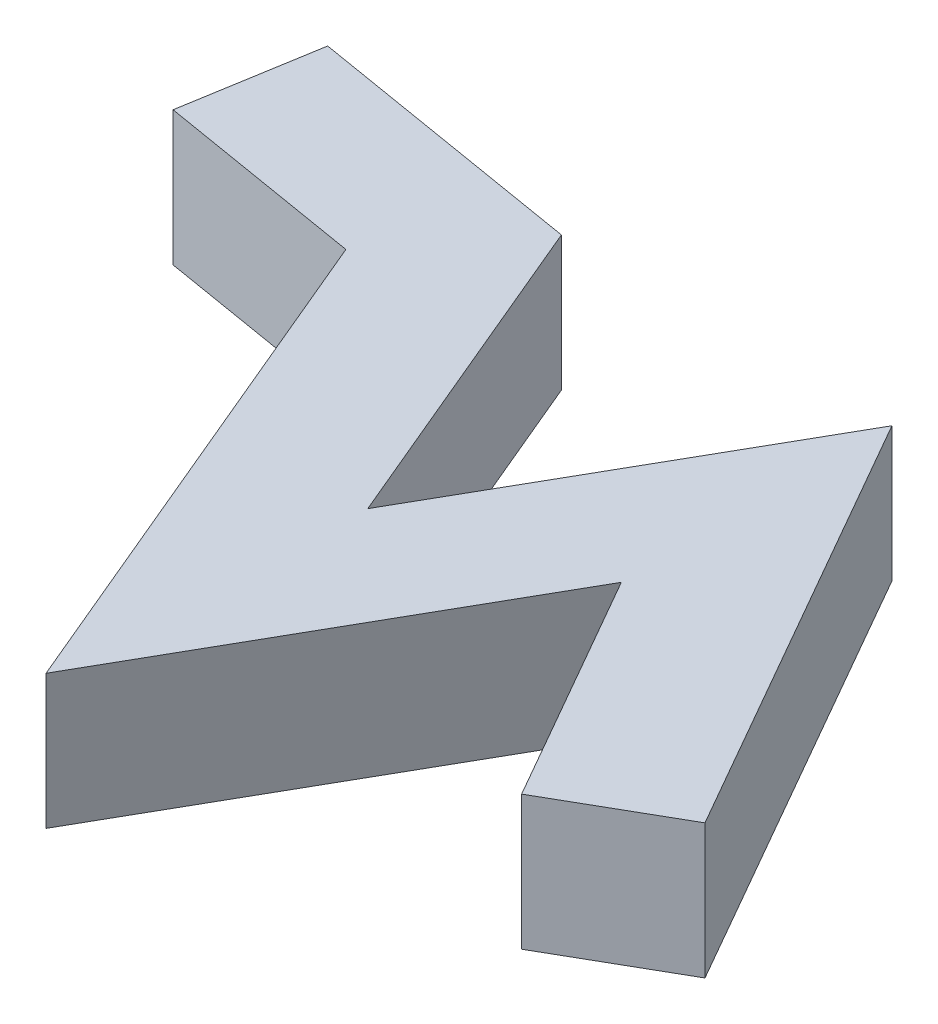
ISO-10303-21;
HEADER;
FILE_DESCRIPTION(('STEP AP214'),'2;1');
FILE_NAME('part.step','',(''),(''),'','','');
FILE_SCHEMA(('AUTOMOTIVE_DESIGN { 1 0 10303 214 1 1 1 1 }'));
ENDSEC;
DATA;
#1=APPLICATION_CONTEXT('core data for automotive mechanical design processes');
#2=APPLICATION_PROTOCOL_DEFINITION('international standard','automotive_design',2000,#1);
#3=PRODUCT_CONTEXT('',#1,'mechanical');
#4=PRODUCT('Part','Part','',(#3));
#5=PRODUCT_RELATED_PRODUCT_CATEGORY('part','',(#4));
#6=PRODUCT_DEFINITION_FORMATION('','',#4);
#7=PRODUCT_DEFINITION_CONTEXT('part definition',#1,'design');
#8=PRODUCT_DEFINITION('design','',#6,#7);
#9=PRODUCT_DEFINITION_SHAPE('','',#8);
#10=(LENGTH_UNIT() NAMED_UNIT(*) SI_UNIT(.MILLI.,.METRE.));
#11=(NAMED_UNIT(*) PLANE_ANGLE_UNIT() SI_UNIT($,.RADIAN.));
#12=(NAMED_UNIT(*) SI_UNIT($,.STERADIAN.) SOLID_ANGLE_UNIT());
#13=UNCERTAINTY_MEASURE_WITH_UNIT(LENGTH_MEASURE(1.E-05),#10,'distance_accuracy_value','');
#14=(GEOMETRIC_REPRESENTATION_CONTEXT(3) GLOBAL_UNCERTAINTY_ASSIGNED_CONTEXT((#13)) GLOBAL_UNIT_ASSIGNED_CONTEXT((#10,
#11,#12)) REPRESENTATION_CONTEXT('',''));
#15=CARTESIAN_POINT('',(0.,0.,0.));
#16=DIRECTION('',(0.,0.,1.));
#17=DIRECTION('',(1.,0.,0.));
#18=AXIS2_PLACEMENT_3D('',#15,#16,#17);
#19=CARTESIAN_POINT('',(-67.5753135376943,10.,-15.5335849533156));
#20=DIRECTION('',(0.86783517541517,0.,-0.496852199665174));
#21=DIRECTION('',(-0.496852199665174,0.,-0.86783517541517));
#22=AXIS2_PLACEMENT_3D('',#19,#20,#21);
#23=PLANE('',#22);
#24=DIRECTION('',(0.496852199665174,0.,0.86783517541517));
#25=VECTOR('',#24,1.);
#26=CARTESIAN_POINT('',(-67.5753135376943,0.,-15.5335849533156));
#27=LINE('',#26,#25);
#28=CARTESIAN_POINT('',(-58.8778169106935,0.,-0.341957511487577));
#29=VERTEX_POINT('',#28);
#30=CARTESIAN_POINT('',(-48.9370344922694,0.,17.0212757793598));
#31=VERTEX_POINT('',#30);
#32=EDGE_CURVE('E140',#29,#31,#27,.T.);
#33=ORIENTED_EDGE('',*,*,#32,.T.);
#34=DIRECTION('',(0.,-1.,0.));
#35=VECTOR('',#34,1.);
#36=CARTESIAN_POINT('',(-48.9370344922694,10.,17.0212757793598));
#37=LINE('',#36,#35);
#38=CARTESIAN_POINT('',(-48.9370344922694,10.,17.0212757793598));
#39=VERTEX_POINT('',#38);
#40=EDGE_CURVE('E11',#39,#31,#37,.T.);
#41=ORIENTED_EDGE('',*,*,#40,.F.);
#42=DIRECTION('',(0.496852199665174,0.,0.86783517541517));
#43=VECTOR('',#42,1.);
#44=CARTESIAN_POINT('',(-67.5753135376943,10.,-15.5335849533156));
#45=LINE('',#44,#43);
#46=CARTESIAN_POINT('',(-58.8778169106935,10.,-0.341957511487577));
#47=VERTEX_POINT('',#46);
#48=EDGE_CURVE('E95',#47,#39,#45,.T.);
#49=ORIENTED_EDGE('',*,*,#48,.F.);
#50=DIRECTION('',(0.,-1.,0.));
#51=VECTOR('',#50,1.);
#52=CARTESIAN_POINT('',(-58.8778169106935,10.,-0.341957511487577));
#53=LINE('',#52,#51);
#54=EDGE_CURVE('E136',#47,#29,#53,.T.);
#55=ORIENTED_EDGE('',*,*,#54,.T.);
#56=EDGE_LOOP('',(#33,#41,#49,#55));
#57=FACE_BOUND('',#56,.T.);
#58=ADVANCED_FACE('F33',(#57),#23,.F.);
#59=CARTESIAN_POINT('',(-40.2586827381177,10.,12.0527537827081));
#60=DIRECTION('',(0.496852199665174,0.,0.86783517541517));
#61=DIRECTION('',(0.86783517541517,0.,-0.496852199665174));
#62=AXIS2_PLACEMENT_3D('',#59,#60,#61);
#63=PLANE('',#62);
#64=DIRECTION('',(-0.867835175415169,0.,0.496852199665174));
#65=VECTOR('',#64,1.);
#66=CARTESIAN_POINT('',(-40.2586827381177,0.,12.0527537827081));
#67=LINE('',#66,#65);
#68=CARTESIAN_POINT('',(-40.2586827381177,0.,12.0527537827081));
#69=VERTEX_POINT('',#68);
#70=EDGE_CURVE('E143',#69,#31,#67,.T.);
#71=ORIENTED_EDGE('',*,*,#70,.F.);
#72=DIRECTION('',(0.,-1.,0.));
#73=VECTOR('',#72,1.);
#74=CARTESIAN_POINT('',(-40.2586827381177,10.,12.0527537827081));
#75=LINE('',#74,#73);
#76=CARTESIAN_POINT('',(-40.2586827381177,10.,12.0527537827081));
#77=VERTEX_POINT('',#76);
#78=EDGE_CURVE('E41',#77,#69,#75,.T.);
#79=ORIENTED_EDGE('',*,*,#78,.F.);
#80=DIRECTION('',(-0.867835175415169,0.,0.496852199665174));
#81=VECTOR('',#80,1.);
#82=CARTESIAN_POINT('',(-40.2586827381177,10.,12.0527537827081));
#83=LINE('',#82,#81);
#84=EDGE_CURVE('E196',#77,#39,#83,.T.);
#85=ORIENTED_EDGE('',*,*,#84,.T.);
#86=ORIENTED_EDGE('',*,*,#40,.T.);
#87=EDGE_LOOP('',(#71,#79,#85,#86));
#88=FACE_BOUND('',#87,.T.);
#89=ADVANCED_FACE('F183',(#88),#63,.T.);
#90=CARTESIAN_POINT('',(-58.8969617835426,10.,-20.5021069499674));
#91=DIRECTION('',(0.86783517541517,0.,-0.496852199665174));
#92=DIRECTION('',(-0.496852199665174,0.,-0.86783517541517));
#93=AXIS2_PLACEMENT_3D('',#90,#91,#92);
#94=PLANE('',#93);
#95=DIRECTION('',(0.496852199665174,0.,0.86783517541517));
#96=VECTOR('',#95,1.);
#97=CARTESIAN_POINT('',(-58.8969617835426,0.,-20.5021069499674));
#98=LINE('',#97,#96);
#99=CARTESIAN_POINT('',(-58.8969617835426,0.,-20.5021069499674));
#100=VERTEX_POINT('',#99);
#101=EDGE_CURVE('E146',#100,#69,#98,.T.);
#102=ORIENTED_EDGE('',*,*,#101,.F.);
#103=DIRECTION('',(0.,-1.,0.));
#104=VECTOR('',#103,1.);
#105=CARTESIAN_POINT('',(-58.8969617835426,10.,-20.5021069499674));
#106=LINE('',#105,#104);
#107=CARTESIAN_POINT('',(-58.8969617835426,10.,-20.5021069499674));
#108=VERTEX_POINT('',#107);
#109=EDGE_CURVE('E173',#108,#100,#106,.T.);
#110=ORIENTED_EDGE('',*,*,#109,.F.);
#111=DIRECTION('',(0.496852199665174,0.,0.86783517541517));
#112=VECTOR('',#111,1.);
#113=CARTESIAN_POINT('',(-58.8969617835426,10.,-20.5021069499674));
#114=LINE('',#113,#112);
#115=EDGE_CURVE('E180',#108,#77,#114,.T.);
#116=ORIENTED_EDGE('',*,*,#115,.T.);
#117=ORIENTED_EDGE('',*,*,#78,.T.);
#118=EDGE_LOOP('',(#102,#110,#116,#117));
#119=FACE_BOUND('',#118,.T.);
#120=ADVANCED_FACE('F178',(#119),#94,.T.);
#121=CARTESIAN_POINT('',(-73.0620538580655,10.,4.34893177726581));
#122=DIRECTION('',(-0.868777270192661,0.,-0.495203044009817));
#123=DIRECTION('',(-0.495203044009817,0.,0.868777270192661));
#124=AXIS2_PLACEMENT_3D('',#121,#122,#123);
#125=PLANE('',#124);
#126=DIRECTION('',(0.495203044009817,0.,-0.868777270192661));
#127=VECTOR('',#126,1.);
#128=CARTESIAN_POINT('',(-73.0620538580655,0.,4.34893177726581));
#129=LINE('',#128,#127);
#130=CARTESIAN_POINT('',(-73.0620538580655,0.,4.34893177726581));
#131=VERTEX_POINT('',#130);
#132=EDGE_CURVE('E149',#131,#100,#129,.T.);
#133=ORIENTED_EDGE('',*,*,#132,.F.);
#134=DIRECTION('',(0.,-1.,0.));
#135=VECTOR('',#134,1.);
#136=CARTESIAN_POINT('',(-73.0620538580655,10.,4.34893177726581));
#137=LINE('',#136,#135);
#138=CARTESIAN_POINT('',(-73.0620538580655,10.,4.34893177726581));
#139=VERTEX_POINT('',#138);
#140=EDGE_CURVE('E171',#139,#131,#137,.T.);
#141=ORIENTED_EDGE('',*,*,#140,.F.);
#142=DIRECTION('',(0.495203044009817,0.,-0.868777270192661));
#143=VECTOR('',#142,1.);
#144=CARTESIAN_POINT('',(-73.0620538580655,10.,4.34893177726581));
#145=LINE('',#144,#143);
#146=EDGE_CURVE('E193',#139,#108,#145,.T.);
#147=ORIENTED_EDGE('',*,*,#146,.T.);
#148=ORIENTED_EDGE('',*,*,#109,.T.);
#149=EDGE_LOOP('',(#133,#141,#147,#148));
#150=FACE_BOUND('',#149,.T.);
#151=ADVANCED_FACE('F190',(#150),#125,.T.);
#152=CARTESIAN_POINT('',(-83.4994901235034,10.,-20.5021069499674));
#153=DIRECTION('',(0.921982105607361,0.,-0.387232484355092));
#154=DIRECTION('',(-0.387232484355092,0.,-0.921982105607361));
#155=AXIS2_PLACEMENT_3D('',#152,#153,#154);
#156=PLANE('',#155);
#157=DIRECTION('',(0.387232484355092,0.,0.921982105607361));
#158=VECTOR('',#157,1.);
#159=CARTESIAN_POINT('',(-83.4994901235034,0.,-20.5021069499674));
#160=LINE('',#159,#158);
#161=CARTESIAN_POINT('',(-83.4994901235034,0.,-20.5021069499674));
#162=VERTEX_POINT('',#161);
#163=EDGE_CURVE('E152',#162,#131,#160,.T.);
#164=ORIENTED_EDGE('',*,*,#163,.F.);
#165=DIRECTION('',(0.,-1.,0.));
#166=VECTOR('',#165,1.);
#167=CARTESIAN_POINT('',(-83.4994901235034,10.,-20.5021069499674));
#168=LINE('',#167,#166);
#169=CARTESIAN_POINT('',(-83.4994901235034,10.,-20.5021069499674));
#170=VERTEX_POINT('',#169);
#171=EDGE_CURVE('E169',#170,#162,#168,.T.);
#172=ORIENTED_EDGE('',*,*,#171,.F.);
#173=DIRECTION('',(0.387232484355092,0.,0.921982105607361));
#174=VECTOR('',#173,1.);
#175=CARTESIAN_POINT('',(-83.4994901235034,10.,-20.5021069499674));
#176=LINE('',#175,#174);
#177=EDGE_CURVE('E198',#170,#139,#176,.T.);
#178=ORIENTED_EDGE('',*,*,#177,.T.);
#179=ORIENTED_EDGE('',*,*,#140,.T.);
#180=EDGE_LOOP('',(#164,#172,#178,#179));
#181=FACE_BOUND('',#180,.T.);
#182=ADVANCED_FACE('F232',(#181),#156,.T.);
#183=CARTESIAN_POINT('',(-104.374362654379,10.,-23.98125237178));
#184=DIRECTION('',(0.164398987305357,0.,-0.986393923832144));
#185=DIRECTION('',(-0.986393923832144,0.,-0.164398987305357));
#186=AXIS2_PLACEMENT_3D('',#183,#184,#185);
#187=PLANE('',#186);
#188=DIRECTION('',(0.986393923832144,0.,0.164398987305358));
#189=VECTOR('',#188,1.);
#190=CARTESIAN_POINT('',(-104.374362654379,0.,-23.98125237178));
#191=LINE('',#190,#189);
#192=CARTESIAN_POINT('',(-104.374362654379,0.,-23.98125237178));
#193=VERTEX_POINT('',#192);
#194=EDGE_CURVE('E155',#193,#162,#191,.T.);
#195=ORIENTED_EDGE('',*,*,#194,.F.);
#196=DIRECTION('',(0.,-1.,0.));
#197=VECTOR('',#196,1.);
#198=CARTESIAN_POINT('',(-104.374362654379,10.,-23.98125237178));
#199=LINE('',#198,#197);
#200=CARTESIAN_POINT('',(-104.374362654379,10.,-23.98125237178));
#201=VERTEX_POINT('',#200);
#202=EDGE_CURVE('E167',#201,#193,#199,.T.);
#203=ORIENTED_EDGE('',*,*,#202,.F.);
#204=DIRECTION('',(0.986393923832144,0.,0.164398987305358));
#205=VECTOR('',#204,1.);
#206=CARTESIAN_POINT('',(-104.374362654379,10.,-23.98125237178));
#207=LINE('',#206,#205);
#208=EDGE_CURVE('E204',#201,#170,#207,.T.);
#209=ORIENTED_EDGE('',*,*,#208,.T.);
#210=ORIENTED_EDGE('',*,*,#171,.T.);
#211=EDGE_LOOP('',(#195,#203,#209,#210));
#212=FACE_BOUND('',#211,.T.);
#213=ADVANCED_FACE('F235',(#212),#187,.T.);
#214=CARTESIAN_POINT('',(-106.018352527433,10.,-14.1173131334586));
#215=DIRECTION('',(-0.986393923832144,0.,-0.164398987305357));
#216=DIRECTION('',(-0.164398987305357,0.,0.986393923832144));
#217=AXIS2_PLACEMENT_3D('',#214,#215,#216);
#218=PLANE('',#217);
#219=DIRECTION('',(0.164398987305357,0.,-0.986393923832144));
#220=VECTOR('',#219,1.);
#221=CARTESIAN_POINT('',(-106.018352527433,0.,-14.1173131334586));
#222=LINE('',#221,#220);
#223=CARTESIAN_POINT('',(-106.018352527433,0.,-14.1173131334586));
#224=VERTEX_POINT('',#223);
#225=EDGE_CURVE('E158',#224,#193,#222,.T.);
#226=ORIENTED_EDGE('',*,*,#225,.F.);
#227=DIRECTION('',(0.,-1.,0.));
#228=VECTOR('',#227,1.);
#229=CARTESIAN_POINT('',(-106.018352527433,10.,-14.1173131334586));
#230=LINE('',#229,#228);
#231=CARTESIAN_POINT('',(-106.018352527433,10.,-14.1173131334586));
#232=VERTEX_POINT('',#231);
#233=EDGE_CURVE('E131',#232,#224,#230,.T.);
#234=ORIENTED_EDGE('',*,*,#233,.F.);
#235=DIRECTION('',(0.164398987305357,0.,-0.986393923832144));
#236=VECTOR('',#235,1.);
#237=CARTESIAN_POINT('',(-106.018352527433,10.,-14.1173131334586));
#238=LINE('',#237,#236);
#239=EDGE_CURVE('E124',#232,#201,#238,.T.);
#240=ORIENTED_EDGE('',*,*,#239,.T.);
#241=ORIENTED_EDGE('',*,*,#202,.T.);
#242=EDGE_LOOP('',(#226,#234,#240,#241));
#243=FACE_BOUND('',#242,.T.);
#244=ADVANCED_FACE('F208',(#243),#218,.T.);
#245=CARTESIAN_POINT('',(-106.018352527433,10.,-14.1173131334586));
#246=DIRECTION('',(0.164398987305357,0.,-0.986393923832144));
#247=DIRECTION('',(-0.986393923832144,0.,-0.164398987305357));
#248=AXIS2_PLACEMENT_3D('',#245,#246,#247);
#249=PLANE('',#248);
#250=DIRECTION('',(0.986393923832144,0.,0.164398987305357));
#251=VECTOR('',#250,1.);
#252=CARTESIAN_POINT('',(-106.018352527433,0.,-14.1173131334586));
#253=LINE('',#252,#251);
#254=CARTESIAN_POINT('',(-90.5836446602306,0.,-11.5448618222582));
#255=VERTEX_POINT('',#254);
#256=EDGE_CURVE('E130',#224,#255,#253,.T.);
#257=ORIENTED_EDGE('',*,*,#256,.T.);
#258=DIRECTION('',(0.,-1.,0.));
#259=VECTOR('',#258,1.);
#260=CARTESIAN_POINT('',(-90.5836446602306,10.,-11.5448618222582));
#261=LINE('',#260,#259);
#262=CARTESIAN_POINT('',(-90.5836446602306,10.,-11.5448618222582));
#263=VERTEX_POINT('',#262);
#264=EDGE_CURVE('E127',#263,#255,#261,.T.);
#265=ORIENTED_EDGE('',*,*,#264,.F.);
#266=DIRECTION('',(0.986393923832144,0.,0.164398987305357));
#267=VECTOR('',#266,1.);
#268=CARTESIAN_POINT('',(-106.018352527433,10.,-14.1173131334586));
#269=LINE('',#268,#267);
#270=EDGE_CURVE('E117',#232,#263,#269,.T.);
#271=ORIENTED_EDGE('',*,*,#270,.F.);
#272=ORIENTED_EDGE('',*,*,#233,.T.);
#273=EDGE_LOOP('',(#257,#265,#271,#272));
#274=FACE_BOUND('',#273,.T.);
#275=ADVANCED_FACE('F128',(#274),#249,.F.);
#276=CARTESIAN_POINT('',(-92.719311179577,10.,-16.6297821064164));
#277=DIRECTION('',(0.921982105607361,0.,-0.387232484355092));
#278=DIRECTION('',(-0.387232484355092,0.,-0.921982105607361));
#279=AXIS2_PLACEMENT_3D('',#276,#277,#278);
#280=PLANE('',#279);
#281=DIRECTION('',(0.387232484355092,0.,0.921982105607361));
#282=VECTOR('',#281,1.);
#283=CARTESIAN_POINT('',(-92.719311179577,0.,-16.6297821064164));
#284=LINE('',#283,#282);
#285=CARTESIAN_POINT('',(-74.4236214816406,0.,26.9313838410512));
#286=VERTEX_POINT('',#285);
#287=EDGE_CURVE('E83',#255,#286,#284,.T.);
#288=ORIENTED_EDGE('',*,*,#287,.T.);
#289=DIRECTION('',(0.,-1.,0.));
#290=VECTOR('',#289,1.);
#291=CARTESIAN_POINT('',(-74.4236214816406,10.,26.9313838410512));
#292=LINE('',#291,#290);
#293=CARTESIAN_POINT('',(-74.4236214816406,10.,26.9313838410512));
#294=VERTEX_POINT('',#293);
#295=EDGE_CURVE('E132',#294,#286,#292,.T.);
#296=ORIENTED_EDGE('',*,*,#295,.F.);
#297=DIRECTION('',(0.387232484355092,0.,0.921982105607361));
#298=VECTOR('',#297,1.);
#299=CARTESIAN_POINT('',(-92.719311179577,10.,-16.6297821064164));
#300=LINE('',#299,#298);
#301=EDGE_CURVE('E121',#263,#294,#300,.T.);
#302=ORIENTED_EDGE('',*,*,#301,.F.);
#303=ORIENTED_EDGE('',*,*,#264,.T.);
#304=EDGE_LOOP('',(#288,#296,#302,#303));
#305=FACE_BOUND('',#304,.T.);
#306=ADVANCED_FACE('F134',(#305),#280,.F.);
#307=CARTESIAN_POINT('',(-64.3742811561389,10.,9.30096221736397));
#308=DIRECTION('',(-0.868777270192661,0.,-0.495203044009817));
#309=DIRECTION('',(-0.495203044009817,0.,0.868777270192661));
#310=AXIS2_PLACEMENT_3D('',#307,#308,#309);
#311=PLANE('',#310);
#312=DIRECTION('',(0.495203044009817,0.,-0.868777270192661));
#313=VECTOR('',#312,1.);
#314=CARTESIAN_POINT('',(-64.3742811561389,0.,9.30096221736397));
#315=LINE('',#314,#313);
#316=EDGE_CURVE('E89',#286,#29,#315,.T.);
#317=ORIENTED_EDGE('',*,*,#316,.T.);
#318=ORIENTED_EDGE('',*,*,#54,.F.);
#319=DIRECTION('',(0.495203044009817,0.,-0.868777270192661));
#320=VECTOR('',#319,1.);
#321=CARTESIAN_POINT('',(-64.3742811561389,10.,9.30096221736397));
#322=LINE('',#321,#320);
#323=EDGE_CURVE('E49',#294,#47,#322,.T.);
#324=ORIENTED_EDGE('',*,*,#323,.F.);
#325=ORIENTED_EDGE('',*,*,#295,.T.);
#326=EDGE_LOOP('',(#317,#318,#324,#325));
#327=FACE_BOUND('',#326,.T.);
#328=ADVANCED_FACE('F211',(#327),#311,.F.);
#329=CARTESIAN_POINT('',(0.,10.,0.));
#330=DIRECTION('',(0.,-1.,0.));
#331=DIRECTION('',(-1.,0.,0.));
#332=AXIS2_PLACEMENT_3D('',#329,#330,#331);
#333=PLANE('',#332);
#334=ORIENTED_EDGE('',*,*,#48,.T.);
#335=ORIENTED_EDGE('',*,*,#84,.F.);
#336=ORIENTED_EDGE('',*,*,#115,.F.);
#337=ORIENTED_EDGE('',*,*,#146,.F.);
#338=ORIENTED_EDGE('',*,*,#177,.F.);
#339=ORIENTED_EDGE('',*,*,#208,.F.);
#340=ORIENTED_EDGE('',*,*,#239,.F.);
#341=ORIENTED_EDGE('',*,*,#270,.T.);
#342=ORIENTED_EDGE('',*,*,#301,.T.);
#343=ORIENTED_EDGE('',*,*,#323,.T.);
#344=EDGE_LOOP('',(#334,#335,#336,#337,#338,#339,#340,#341,#342,#343));
#345=FACE_BOUND('',#344,.T.);
#346=ADVANCED_FACE('F119',(#345),#333,.F.);
#347=CARTESIAN_POINT('',(0.,0.,0.));
#348=DIRECTION('',(0.,-1.,0.));
#349=DIRECTION('',(-1.,0.,0.));
#350=AXIS2_PLACEMENT_3D('',#347,#348,#349);
#351=PLANE('',#350);
#352=ORIENTED_EDGE('',*,*,#32,.F.);
#353=ORIENTED_EDGE('',*,*,#316,.F.);
#354=ORIENTED_EDGE('',*,*,#287,.F.);
#355=ORIENTED_EDGE('',*,*,#256,.F.);
#356=ORIENTED_EDGE('',*,*,#225,.T.);
#357=ORIENTED_EDGE('',*,*,#194,.T.);
#358=ORIENTED_EDGE('',*,*,#163,.T.);
#359=ORIENTED_EDGE('',*,*,#132,.T.);
#360=ORIENTED_EDGE('',*,*,#101,.T.);
#361=ORIENTED_EDGE('',*,*,#70,.T.);
#362=EDGE_LOOP('',(#352,#353,#354,#355,#356,#357,#358,#359,#360,#361));
#363=FACE_BOUND('',#362,.T.);
#364=ADVANCED_FACE('F186',(#363),#351,.T.);
#365=CLOSED_SHELL('',(#58,#89,#120,#151,#182,#213,#244,#275,#306,#328,#346,#364));
#366=MANIFOLD_SOLID_BREP('B2',#365);
#367=ADVANCED_BREP_SHAPE_REPRESENTATION('',(#18,#366),#14);
#368=SHAPE_DEFINITION_REPRESENTATION(#9,#367);
ENDSEC;
END-ISO-10303-21;
